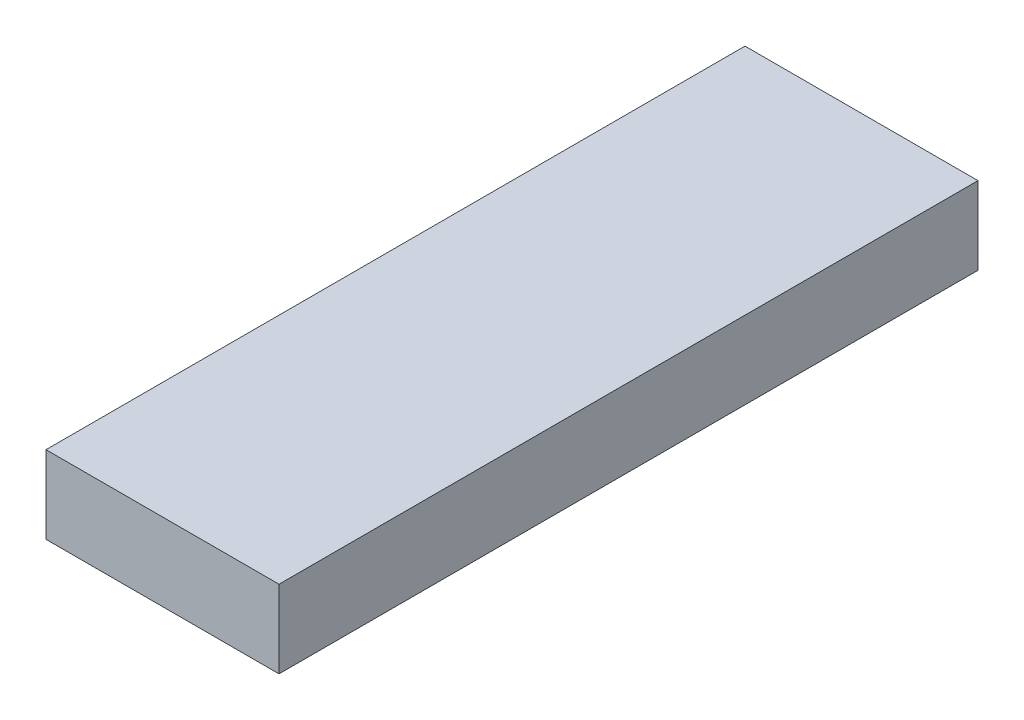
ISO-10303-21;
HEADER;
FILE_DESCRIPTION(('STEP AP214'),'2;1');
FILE_NAME('part.step','',(''),(''),'','','');
FILE_SCHEMA(('AUTOMOTIVE_DESIGN { 1 0 10303 214 1 1 1 1 }'));
ENDSEC;
DATA;
#1=APPLICATION_CONTEXT('core data for automotive mechanical design processes');
#2=APPLICATION_PROTOCOL_DEFINITION('international standard','automotive_design',2000,#1);
#3=PRODUCT_CONTEXT('',#1,'mechanical');
#4=PRODUCT('Part','Part','',(#3));
#5=PRODUCT_RELATED_PRODUCT_CATEGORY('part','',(#4));
#6=PRODUCT_DEFINITION_FORMATION('','',#4);
#7=PRODUCT_DEFINITION_CONTEXT('part definition',#1,'design');
#8=PRODUCT_DEFINITION('design','',#6,#7);
#9=PRODUCT_DEFINITION_SHAPE('','',#8);
#10=(LENGTH_UNIT() NAMED_UNIT(*) SI_UNIT(.MILLI.,.METRE.));
#11=(NAMED_UNIT(*) PLANE_ANGLE_UNIT() SI_UNIT($,.RADIAN.));
#12=(NAMED_UNIT(*) SI_UNIT($,.STERADIAN.) SOLID_ANGLE_UNIT());
#13=UNCERTAINTY_MEASURE_WITH_UNIT(LENGTH_MEASURE(1.E-05),#10,'distance_accuracy_value','');
#14=(GEOMETRIC_REPRESENTATION_CONTEXT(3) GLOBAL_UNCERTAINTY_ASSIGNED_CONTEXT((#13)) GLOBAL_UNIT_ASSIGNED_CONTEXT((#10,
#11,#12)) REPRESENTATION_CONTEXT('',''));
#15=CARTESIAN_POINT('',(0.,0.,0.));
#16=DIRECTION('',(0.,0.,1.));
#17=DIRECTION('',(1.,0.,0.));
#18=AXIS2_PLACEMENT_3D('',#15,#16,#17);
#19=CARTESIAN_POINT('',(1500.,1000.,4500.));
#20=DIRECTION('',(-1.,0.,0.));
#21=DIRECTION('',(0.,0.,1.));
#22=AXIS2_PLACEMENT_3D('',#19,#20,#21);
#23=PLANE('',#22);
#24=DIRECTION('',(0.,0.,-1.));
#25=VECTOR('',#24,1.);
#26=CARTESIAN_POINT('',(1500.,0.,4500.));
#27=LINE('',#26,#25);
#28=CARTESIAN_POINT('',(1500.,0.,4500.));
#29=VERTEX_POINT('',#28);
#30=CARTESIAN_POINT('',(1500.,0.,-4500.));
#31=VERTEX_POINT('',#30);
#32=EDGE_CURVE('E107',#29,#31,#27,.T.);
#33=ORIENTED_EDGE('',*,*,#32,.T.);
#34=DIRECTION('',(0.,-1.,0.));
#35=VECTOR('',#34,1.);
#36=CARTESIAN_POINT('',(1500.,1000.,-4500.));
#37=LINE('',#36,#35);
#38=CARTESIAN_POINT('',(1500.,1000.,-4500.));
#39=VERTEX_POINT('',#38);
#40=EDGE_CURVE('E11',#39,#31,#37,.T.);
#41=ORIENTED_EDGE('',*,*,#40,.F.);
#42=DIRECTION('',(0.,0.,-1.));
#43=VECTOR('',#42,1.);
#44=CARTESIAN_POINT('',(1500.,1000.,4500.));
#45=LINE('',#44,#43);
#46=CARTESIAN_POINT('',(1500.,1000.,4500.));
#47=VERTEX_POINT('',#46);
#48=EDGE_CURVE('E91',#47,#39,#45,.T.);
#49=ORIENTED_EDGE('',*,*,#48,.F.);
#50=DIRECTION('',(0.,-1.,0.));
#51=VECTOR('',#50,1.);
#52=CARTESIAN_POINT('',(1500.,1000.,4500.));
#53=LINE('',#52,#51);
#54=EDGE_CURVE('E103',#47,#29,#53,.T.);
#55=ORIENTED_EDGE('',*,*,#54,.T.);
#56=EDGE_LOOP('',(#33,#41,#49,#55));
#57=FACE_BOUND('',#56,.T.);
#58=ADVANCED_FACE('F39',(#57),#23,.F.);
#59=CARTESIAN_POINT('',(-1500.,1000.,-4500.));
#60=DIRECTION('',(0.,0.,1.));
#61=DIRECTION('',(1.,0.,0.));
#62=AXIS2_PLACEMENT_3D('',#59,#60,#61);
#63=PLANE('',#62);
#64=DIRECTION('',(-1.,0.,0.));
#65=VECTOR('',#64,1.);
#66=CARTESIAN_POINT('',(-1500.,0.,-4500.));
#67=LINE('',#66,#65);
#68=CARTESIAN_POINT('',(-1500.,0.,-4500.));
#69=VERTEX_POINT('',#68);
#70=EDGE_CURVE('E96',#31,#69,#67,.T.);
#71=ORIENTED_EDGE('',*,*,#70,.T.);
#72=DIRECTION('',(0.,-1.,0.));
#73=VECTOR('',#72,1.);
#74=CARTESIAN_POINT('',(-1500.,1000.,-4500.));
#75=LINE('',#74,#73);
#76=CARTESIAN_POINT('',(-1500.,1000.,-4500.));
#77=VERTEX_POINT('',#76);
#78=EDGE_CURVE('E48',#77,#69,#75,.T.);
#79=ORIENTED_EDGE('',*,*,#78,.F.);
#80=DIRECTION('',(-1.,0.,0.));
#81=VECTOR('',#80,1.);
#82=CARTESIAN_POINT('',(-1500.,1000.,-4500.));
#83=LINE('',#82,#81);
#84=EDGE_CURVE('E86',#39,#77,#83,.T.);
#85=ORIENTED_EDGE('',*,*,#84,.F.);
#86=ORIENTED_EDGE('',*,*,#40,.T.);
#87=EDGE_LOOP('',(#71,#79,#85,#86));
#88=FACE_BOUND('',#87,.T.);
#89=ADVANCED_FACE('F95',(#88),#63,.F.);
#90=CARTESIAN_POINT('',(-1500.,1000.,4500.));
#91=DIRECTION('',(1.,0.,0.));
#92=DIRECTION('',(0.,0.,-1.));
#93=AXIS2_PLACEMENT_3D('',#90,#91,#92);
#94=PLANE('',#93);
#95=DIRECTION('',(0.,0.,1.));
#96=VECTOR('',#95,1.);
#97=CARTESIAN_POINT('',(-1500.,0.,4500.));
#98=LINE('',#97,#96);
#99=CARTESIAN_POINT('',(-1500.,0.,4500.));
#100=VERTEX_POINT('',#99);
#101=EDGE_CURVE('E73',#69,#100,#98,.T.);
#102=ORIENTED_EDGE('',*,*,#101,.T.);
#103=DIRECTION('',(0.,-1.,0.));
#104=VECTOR('',#103,1.);
#105=CARTESIAN_POINT('',(-1500.,1000.,4500.));
#106=LINE('',#105,#104);
#107=CARTESIAN_POINT('',(-1500.,1000.,4500.));
#108=VERTEX_POINT('',#107);
#109=EDGE_CURVE('E98',#108,#100,#106,.T.);
#110=ORIENTED_EDGE('',*,*,#109,.F.);
#111=DIRECTION('',(0.,0.,1.));
#112=VECTOR('',#111,1.);
#113=CARTESIAN_POINT('',(-1500.,1000.,4500.));
#114=LINE('',#113,#112);
#115=EDGE_CURVE('E89',#77,#108,#114,.T.);
#116=ORIENTED_EDGE('',*,*,#115,.F.);
#117=ORIENTED_EDGE('',*,*,#78,.T.);
#118=EDGE_LOOP('',(#102,#110,#116,#117));
#119=FACE_BOUND('',#118,.T.);
#120=ADVANCED_FACE('F99',(#119),#94,.F.);
#121=CARTESIAN_POINT('',(-1500.,1000.,4500.));
#122=DIRECTION('',(0.,0.,-1.));
#123=DIRECTION('',(-1.,0.,0.));
#124=AXIS2_PLACEMENT_3D('',#121,#122,#123);
#125=PLANE('',#124);
#126=DIRECTION('',(1.,0.,0.));
#127=VECTOR('',#126,1.);
#128=CARTESIAN_POINT('',(-1500.,0.,4500.));
#129=LINE('',#128,#127);
#130=EDGE_CURVE('E79',#100,#29,#129,.T.);
#131=ORIENTED_EDGE('',*,*,#130,.T.);
#132=ORIENTED_EDGE('',*,*,#54,.F.);
#133=DIRECTION('',(1.,0.,0.));
#134=VECTOR('',#133,1.);
#135=CARTESIAN_POINT('',(-1500.,1000.,4500.));
#136=LINE('',#135,#134);
#137=EDGE_CURVE('E56',#108,#47,#136,.T.);
#138=ORIENTED_EDGE('',*,*,#137,.F.);
#139=ORIENTED_EDGE('',*,*,#109,.T.);
#140=EDGE_LOOP('',(#131,#132,#138,#139));
#141=FACE_BOUND('',#140,.T.);
#142=ADVANCED_FACE('F120',(#141),#125,.F.);
#143=CARTESIAN_POINT('',(0.,1000.,0.));
#144=DIRECTION('',(0.,-1.,0.));
#145=DIRECTION('',(0.,0.,-1.));
#146=AXIS2_PLACEMENT_3D('',#143,#144,#145);
#147=PLANE('',#146);
#148=ORIENTED_EDGE('',*,*,#48,.T.);
#149=ORIENTED_EDGE('',*,*,#84,.T.);
#150=ORIENTED_EDGE('',*,*,#115,.T.);
#151=ORIENTED_EDGE('',*,*,#137,.T.);
#152=EDGE_LOOP('',(#148,#149,#150,#151));
#153=FACE_BOUND('',#152,.T.);
#154=ADVANCED_FACE('F87',(#153),#147,.F.);
#155=CARTESIAN_POINT('',(0.,0.,0.));
#156=DIRECTION('',(0.,-1.,0.));
#157=DIRECTION('',(0.,0.,-1.));
#158=AXIS2_PLACEMENT_3D('',#155,#156,#157);
#159=PLANE('',#158);
#160=ORIENTED_EDGE('',*,*,#32,.F.);
#161=ORIENTED_EDGE('',*,*,#130,.F.);
#162=ORIENTED_EDGE('',*,*,#101,.F.);
#163=ORIENTED_EDGE('',*,*,#70,.F.);
#164=EDGE_LOOP('',(#160,#161,#162,#163));
#165=FACE_BOUND('',#164,.T.);
#166=ADVANCED_FACE('F123',(#165),#159,.T.);
#167=CLOSED_SHELL('',(#58,#89,#120,#142,#154,#166));
#168=MANIFOLD_SOLID_BREP('B2',#167);
#169=ADVANCED_BREP_SHAPE_REPRESENTATION('',(#18,#168),#14);
#170=SHAPE_DEFINITION_REPRESENTATION(#9,#169);
ENDSEC;
END-ISO-10303-21;
